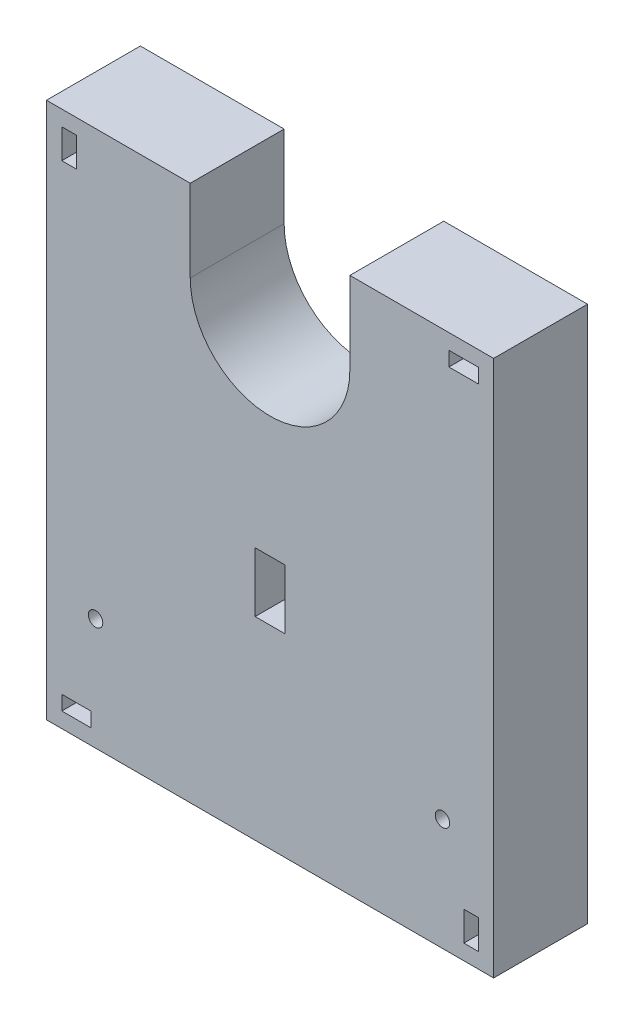
ISO-10303-21;
HEADER;
FILE_DESCRIPTION(('STEP AP214'),'2;1');
FILE_NAME('part.step','',(''),(''),'','','');
FILE_SCHEMA(('AUTOMOTIVE_DESIGN { 1 0 10303 214 1 1 1 1 }'));
ENDSEC;
DATA;
#1=APPLICATION_CONTEXT('core data for automotive mechanical design processes');
#2=APPLICATION_PROTOCOL_DEFINITION('international standard','automotive_design',2000,#1);
#3=PRODUCT_CONTEXT('',#1,'mechanical');
#4=PRODUCT('Part','Part','',(#3));
#5=PRODUCT_RELATED_PRODUCT_CATEGORY('part','',(#4));
#6=PRODUCT_DEFINITION_FORMATION('','',#4);
#7=PRODUCT_DEFINITION_CONTEXT('part definition',#1,'design');
#8=PRODUCT_DEFINITION('design','',#6,#7);
#9=PRODUCT_DEFINITION_SHAPE('','',#8);
#10=(LENGTH_UNIT() NAMED_UNIT(*) SI_UNIT(.MILLI.,.METRE.));
#11=(NAMED_UNIT(*) PLANE_ANGLE_UNIT() SI_UNIT($,.RADIAN.));
#12=(NAMED_UNIT(*) SI_UNIT($,.STERADIAN.) SOLID_ANGLE_UNIT());
#13=UNCERTAINTY_MEASURE_WITH_UNIT(LENGTH_MEASURE(1.E-05),#10,'distance_accuracy_value','');
#14=(GEOMETRIC_REPRESENTATION_CONTEXT(3) GLOBAL_UNCERTAINTY_ASSIGNED_CONTEXT((#13)) GLOBAL_UNIT_ASSIGNED_CONTEXT((#10,
#11,#12)) REPRESENTATION_CONTEXT('',''));
#15=CARTESIAN_POINT('',(0.,0.,0.));
#16=DIRECTION('',(0.,0.,1.));
#17=DIRECTION('',(1.,0.,0.));
#18=AXIS2_PLACEMENT_3D('',#15,#16,#17);
#19=CARTESIAN_POINT('',(47.625,96.8375,20.));
#20=DIRECTION('',(0.,0.,1.));
#21=DIRECTION('',(1.,0.,0.));
#22=AXIS2_PLACEMENT_3D('',#19,#20,#21);
#23=PLANE('',#22);
#24=CARTESIAN_POINT('',(10.4582890568215,23.8529329321801,20.));
#25=DIRECTION('',(0.,0.,1.));
#26=DIRECTION('',(1.,0.,0.));
#27=AXIS2_PLACEMENT_3D('',#24,#25,#26);
#28=CIRCLE('',#27,1.53781619886044);
#29=CARTESIAN_POINT('',(11.9961052556819,23.8529329321801,20.));
#30=VERTEX_POINT('',#29);
#31=EDGE_CURVE('E247',#30,#30,#28,.T.);
#32=ORIENTED_EDGE('',*,*,#31,.F.);
#33=EDGE_LOOP('',(#32));
#34=FACE_BOUND('',#33,.T.);
#35=DIRECTION('',(-1.,0.,0.));
#36=VECTOR('',#35,1.);
#37=CARTESIAN_POINT('',(3.2639,111.0361,20.));
#38=LINE('',#37,#36);
#39=CARTESIAN_POINT('',(6.35,111.0361,20.));
#40=VERTEX_POINT('',#39);
#41=CARTESIAN_POINT('',(3.2639,111.0361,20.));
#42=VERTEX_POINT('',#41);
#43=EDGE_CURVE('E259',#40,#42,#38,.T.);
#44=ORIENTED_EDGE('',*,*,#43,.F.);
#45=DIRECTION('',(0.,1.,0.));
#46=VECTOR('',#45,1.);
#47=CARTESIAN_POINT('',(6.35,104.775,20.));
#48=LINE('',#47,#46);
#49=CARTESIAN_POINT('',(6.35,104.775,20.));
#50=VERTEX_POINT('',#49);
#51=EDGE_CURVE('E257',#50,#40,#48,.T.);
#52=ORIENTED_EDGE('',*,*,#51,.F.);
#53=DIRECTION('',(1.,0.,0.));
#54=VECTOR('',#53,1.);
#55=CARTESIAN_POINT('',(6.35,104.775,20.));
#56=LINE('',#55,#54);
#57=CARTESIAN_POINT('',(3.2639,104.775,20.));
#58=VERTEX_POINT('',#57);
#59=EDGE_CURVE('E265',#58,#50,#56,.T.);
#60=ORIENTED_EDGE('',*,*,#59,.F.);
#61=DIRECTION('',(0.,-1.,0.));
#62=VECTOR('',#61,1.);
#63=CARTESIAN_POINT('',(3.2639,111.0361,20.));
#64=LINE('',#63,#62);
#65=EDGE_CURVE('E262',#42,#58,#64,.T.);
#66=ORIENTED_EDGE('',*,*,#65,.F.);
#67=EDGE_LOOP('',(#44,#52,#60,#66));
#68=FACE_BOUND('',#67,.T.);
#69=DIRECTION('',(-1.,0.,0.));
#70=VECTOR('',#69,1.);
#71=CARTESIAN_POINT('',(44.45,53.975,20.));
#72=LINE('',#71,#70);
#73=CARTESIAN_POINT('',(50.8000000000001,53.975,20.));
#74=VERTEX_POINT('',#73);
#75=CARTESIAN_POINT('',(44.45,53.975,20.));
#76=VERTEX_POINT('',#75);
#77=EDGE_CURVE('E321',#74,#76,#72,.T.);
#78=ORIENTED_EDGE('',*,*,#77,.F.);
#79=DIRECTION('',(0.,1.,0.));
#80=VECTOR('',#79,1.);
#81=CARTESIAN_POINT('',(50.8000000000001,53.975,20.));
#82=LINE('',#81,#80);
#83=CARTESIAN_POINT('',(50.8000000000001,41.275,20.));
#84=VERTEX_POINT('',#83);
#85=EDGE_CURVE('E319',#84,#74,#82,.T.);
#86=ORIENTED_EDGE('',*,*,#85,.F.);
#87=DIRECTION('',(1.,0.,0.));
#88=VECTOR('',#87,1.);
#89=CARTESIAN_POINT('',(50.8000000000001,41.275,20.));
#90=LINE('',#89,#88);
#91=CARTESIAN_POINT('',(44.45,41.275,20.));
#92=VERTEX_POINT('',#91);
#93=EDGE_CURVE('E327',#92,#84,#90,.T.);
#94=ORIENTED_EDGE('',*,*,#93,.F.);
#95=DIRECTION('',(0.,-1.,0.));
#96=VECTOR('',#95,1.);
#97=CARTESIAN_POINT('',(44.45,41.275,20.));
#98=LINE('',#97,#96);
#99=EDGE_CURVE('E324',#76,#92,#98,.T.);
#100=ORIENTED_EDGE('',*,*,#99,.F.);
#101=EDGE_LOOP('',(#78,#86,#94,#100));
#102=FACE_BOUND('',#101,.T.);
#103=DIRECTION('',(0.,-1.,0.));
#104=VECTOR('',#103,1.);
#105=CARTESIAN_POINT('',(0.,0.,20.));
#106=LINE('',#105,#104);
#107=CARTESIAN_POINT('',(0.,114.3,20.));
#108=VERTEX_POINT('',#107);
#109=CARTESIAN_POINT('',(0.,0.,20.));
#110=VERTEX_POINT('',#109);
#111=EDGE_CURVE('E381',#108,#110,#106,.T.);
#112=ORIENTED_EDGE('',*,*,#111,.T.);
#113=DIRECTION('',(1.,0.,0.));
#114=VECTOR('',#113,1.);
#115=CARTESIAN_POINT('',(0.,0.,20.));
#116=LINE('',#115,#114);
#117=CARTESIAN_POINT('',(95.2500000000001,0.,20.));
#118=VERTEX_POINT('',#117);
#119=EDGE_CURVE('E384',#110,#118,#116,.T.);
#120=ORIENTED_EDGE('',*,*,#119,.T.);
#121=DIRECTION('',(0.,1.,0.));
#122=VECTOR('',#121,1.);
#123=CARTESIAN_POINT('',(95.2500000000001,114.3,20.));
#124=LINE('',#123,#122);
#125=CARTESIAN_POINT('',(95.2500000000001,114.3,20.));
#126=VERTEX_POINT('',#125);
#127=EDGE_CURVE('E387',#118,#126,#124,.T.);
#128=ORIENTED_EDGE('',*,*,#127,.T.);
#129=DIRECTION('',(-1.,0.,0.));
#130=VECTOR('',#129,1.);
#131=CARTESIAN_POINT('',(64.625,114.3,20.));
#132=LINE('',#131,#130);
#133=CARTESIAN_POINT('',(64.625,114.3,20.));
#134=VERTEX_POINT('',#133);
#135=EDGE_CURVE('E389',#126,#134,#132,.T.);
#136=ORIENTED_EDGE('',*,*,#135,.T.);
#137=DIRECTION('',(0.,-1.,0.));
#138=VECTOR('',#137,1.);
#139=CARTESIAN_POINT('',(64.625,96.8375,20.));
#140=LINE('',#139,#138);
#141=CARTESIAN_POINT('',(64.625,96.8375,20.));
#142=VERTEX_POINT('',#141);
#143=EDGE_CURVE('E391',#134,#142,#140,.T.);
#144=ORIENTED_EDGE('',*,*,#143,.T.);
#145=CARTESIAN_POINT('',(47.625,96.8375,20.));
#146=DIRECTION('',(0.,0.,-1.));
#147=DIRECTION('',(1.,0.,0.));
#148=AXIS2_PLACEMENT_3D('',#145,#146,#147);
#149=CIRCLE('',#148,17.);
#150=CARTESIAN_POINT('',(30.625,96.8375,20.));
#151=VERTEX_POINT('',#150);
#152=EDGE_CURVE('E393',#142,#151,#149,.T.);
#153=ORIENTED_EDGE('',*,*,#152,.T.);
#154=DIRECTION('',(0.,1.,0.));
#155=VECTOR('',#154,1.);
#156=CARTESIAN_POINT('',(30.625,96.8375,20.));
#157=LINE('',#156,#155);
#158=CARTESIAN_POINT('',(30.625,114.3,20.));
#159=VERTEX_POINT('',#158);
#160=EDGE_CURVE('E395',#151,#159,#157,.T.);
#161=ORIENTED_EDGE('',*,*,#160,.T.);
#162=DIRECTION('',(-1.,0.,0.));
#163=VECTOR('',#162,1.);
#164=CARTESIAN_POINT('',(0.,114.3,20.));
#165=LINE('',#164,#163);
#166=EDGE_CURVE('E397',#159,#108,#165,.T.);
#167=ORIENTED_EDGE('',*,*,#166,.T.);
#168=EDGE_LOOP('',(#112,#120,#128,#136,#144,#153,#161,#167));
#169=FACE_BOUND('',#168,.T.);
#170=DIRECTION('',(1.,0.,0.));
#171=VECTOR('',#170,1.);
#172=CARTESIAN_POINT('',(3.2639,3.2639,20.));
#173=LINE('',#172,#171);
#174=CARTESIAN_POINT('',(3.2639,3.2639,20.));
#175=VERTEX_POINT('',#174);
#176=CARTESIAN_POINT('',(9.525,3.2639,20.));
#177=VERTEX_POINT('',#176);
#178=EDGE_CURVE('E352',#175,#177,#173,.T.);
#179=ORIENTED_EDGE('',*,*,#178,.F.);
#180=DIRECTION('',(0.,-1.,0.));
#181=VECTOR('',#180,1.);
#182=CARTESIAN_POINT('',(3.2639,3.2639,20.));
#183=LINE('',#182,#181);
#184=CARTESIAN_POINT('',(3.2639,6.35,20.));
#185=VERTEX_POINT('',#184);
#186=EDGE_CURVE('E350',#185,#175,#183,.T.);
#187=ORIENTED_EDGE('',*,*,#186,.F.);
#188=DIRECTION('',(-1.,0.,0.));
#189=VECTOR('',#188,1.);
#190=CARTESIAN_POINT('',(9.525,6.35,20.));
#191=LINE('',#190,#189);
#192=CARTESIAN_POINT('',(9.525,6.34999999999999,20.));
#193=VERTEX_POINT('',#192);
#194=EDGE_CURVE('E358',#193,#185,#191,.T.);
#195=ORIENTED_EDGE('',*,*,#194,.F.);
#196=DIRECTION('',(0.,1.,0.));
#197=VECTOR('',#196,1.);
#198=CARTESIAN_POINT('',(9.525,6.35,20.));
#199=LINE('',#198,#197);
#200=EDGE_CURVE('E355',#177,#193,#199,.T.);
#201=ORIENTED_EDGE('',*,*,#200,.F.);
#202=EDGE_LOOP('',(#179,#187,#195,#201));
#203=FACE_BOUND('',#202,.T.);
#204=DIRECTION('',(1.,0.,0.));
#205=VECTOR('',#204,1.);
#206=CARTESIAN_POINT('',(91.9861000000001,3.2639,20.));
#207=LINE('',#206,#205);
#208=CARTESIAN_POINT('',(88.9000000000001,3.2639,20.));
#209=VERTEX_POINT('',#208);
#210=CARTESIAN_POINT('',(91.9861000000001,3.2639,20.));
#211=VERTEX_POINT('',#210);
#212=EDGE_CURVE('E290',#209,#211,#207,.T.);
#213=ORIENTED_EDGE('',*,*,#212,.F.);
#214=DIRECTION('',(0.,-1.,0.));
#215=VECTOR('',#214,1.);
#216=CARTESIAN_POINT('',(88.9000000000001,9.525,20.));
#217=LINE('',#216,#215);
#218=CARTESIAN_POINT('',(88.9000000000001,9.525,20.));
#219=VERTEX_POINT('',#218);
#220=EDGE_CURVE('E288',#219,#209,#217,.T.);
#221=ORIENTED_EDGE('',*,*,#220,.F.);
#222=DIRECTION('',(-1.,0.,0.));
#223=VECTOR('',#222,1.);
#224=CARTESIAN_POINT('',(88.9000000000001,9.525,20.));
#225=LINE('',#224,#223);
#226=CARTESIAN_POINT('',(91.9861000000001,9.52500000000001,20.));
#227=VERTEX_POINT('',#226);
#228=EDGE_CURVE('E296',#227,#219,#225,.T.);
#229=ORIENTED_EDGE('',*,*,#228,.F.);
#230=DIRECTION('',(0.,1.,0.));
#231=VECTOR('',#230,1.);
#232=CARTESIAN_POINT('',(91.9861000000001,3.2639,20.));
#233=LINE('',#232,#231);
#234=EDGE_CURVE('E293',#211,#227,#233,.T.);
#235=ORIENTED_EDGE('',*,*,#234,.F.);
#236=EDGE_LOOP('',(#213,#221,#229,#235));
#237=FACE_BOUND('',#236,.T.);
#238=DIRECTION('',(-1.,0.,0.));
#239=VECTOR('',#238,1.);
#240=CARTESIAN_POINT('',(91.9861000000001,111.0361,20.));
#241=LINE('',#240,#239);
#242=CARTESIAN_POINT('',(91.9861000000001,111.0361,20.));
#243=VERTEX_POINT('',#242);
#244=CARTESIAN_POINT('',(85.7250000000001,111.0361,20.));
#245=VERTEX_POINT('',#244);
#246=EDGE_CURVE('E226',#243,#245,#241,.T.);
#247=ORIENTED_EDGE('',*,*,#246,.F.);
#248=DIRECTION('',(0.,1.,0.));
#249=VECTOR('',#248,1.);
#250=CARTESIAN_POINT('',(91.9861000000001,111.0361,20.));
#251=LINE('',#250,#249);
#252=CARTESIAN_POINT('',(91.9861000000001,107.95,20.));
#253=VERTEX_POINT('',#252);
#254=EDGE_CURVE('E218',#253,#243,#251,.T.);
#255=ORIENTED_EDGE('',*,*,#254,.F.);
#256=DIRECTION('',(1.,0.,0.));
#257=VECTOR('',#256,1.);
#258=CARTESIAN_POINT('',(85.7250000000001,107.95,20.));
#259=LINE('',#258,#257);
#260=CARTESIAN_POINT('',(85.7250000000001,107.95,20.));
#261=VERTEX_POINT('',#260);
#262=EDGE_CURVE('E241',#261,#253,#259,.T.);
#263=ORIENTED_EDGE('',*,*,#262,.F.);
#264=DIRECTION('',(0.,-1.,0.));
#265=VECTOR('',#264,1.);
#266=CARTESIAN_POINT('',(85.7250000000001,107.95,20.));
#267=LINE('',#266,#265);
#268=EDGE_CURVE('E239',#245,#261,#267,.T.);
#269=ORIENTED_EDGE('',*,*,#268,.F.);
#270=EDGE_LOOP('',(#247,#255,#263,#269));
#271=FACE_BOUND('',#270,.T.);
#272=CARTESIAN_POINT('',(84.3480052556819,23.8529329321801,20.));
#273=DIRECTION('',(0.,0.,1.));
#274=DIRECTION('',(1.,0.,0.));
#275=AXIS2_PLACEMENT_3D('',#272,#273,#274);
#276=CIRCLE('',#275,1.53669999999999);
#277=CARTESIAN_POINT('',(85.8847052556819,23.8529329321801,20.));
#278=VERTEX_POINT('',#277);
#279=EDGE_CURVE('E711',#278,#278,#276,.T.);
#280=ORIENTED_EDGE('',*,*,#279,.F.);
#281=EDGE_LOOP('',(#280));
#282=FACE_BOUND('',#281,.T.);
#283=ADVANCED_FACE('F33',(#34,#68,#102,#169,#203,#237,#271,#282),#23,.T.);
#284=CARTESIAN_POINT('',(47.625,96.8375,0.));
#285=DIRECTION('',(0.,0.,1.));
#286=DIRECTION('',(1.,0.,0.));
#287=AXIS2_PLACEMENT_3D('',#284,#285,#286);
#288=PLANE('',#287);
#289=CARTESIAN_POINT('',(10.4582890568215,23.8529329321801,0.));
#290=DIRECTION('',(0.,0.,1.));
#291=DIRECTION('',(1.,0.,0.));
#292=AXIS2_PLACEMENT_3D('',#289,#290,#291);
#293=CIRCLE('',#292,1.53781619886044);
#294=CARTESIAN_POINT('',(11.9961052556819,23.8529329321801,0.));
#295=VERTEX_POINT('',#294);
#296=EDGE_CURVE('E717',#295,#295,#293,.T.);
#297=ORIENTED_EDGE('',*,*,#296,.T.);
#298=EDGE_LOOP('',(#297));
#299=FACE_BOUND('',#298,.T.);
#300=DIRECTION('',(0.,1.,0.));
#301=VECTOR('',#300,1.);
#302=CARTESIAN_POINT('',(6.35,104.775,0.));
#303=LINE('',#302,#301);
#304=CARTESIAN_POINT('',(6.34999999999999,104.775,0.));
#305=VERTEX_POINT('',#304);
#306=CARTESIAN_POINT('',(6.35,111.0361,0.));
#307=VERTEX_POINT('',#306);
#308=EDGE_CURVE('E234',#305,#307,#303,.T.);
#309=ORIENTED_EDGE('',*,*,#308,.T.);
#310=DIRECTION('',(-1.,0.,0.));
#311=VECTOR('',#310,1.);
#312=CARTESIAN_POINT('',(3.2639,111.0361,0.));
#313=LINE('',#312,#311);
#314=CARTESIAN_POINT('',(3.2639,111.0361,0.));
#315=VERTEX_POINT('',#314);
#316=EDGE_CURVE('E270',#307,#315,#313,.T.);
#317=ORIENTED_EDGE('',*,*,#316,.T.);
#318=DIRECTION('',(0.,-1.,0.));
#319=VECTOR('',#318,1.);
#320=CARTESIAN_POINT('',(3.2639,111.0361,0.));
#321=LINE('',#320,#319);
#322=CARTESIAN_POINT('',(3.2639,104.775,0.));
#323=VERTEX_POINT('',#322);
#324=EDGE_CURVE('E273',#315,#323,#321,.T.);
#325=ORIENTED_EDGE('',*,*,#324,.T.);
#326=DIRECTION('',(1.,0.,0.));
#327=VECTOR('',#326,1.);
#328=CARTESIAN_POINT('',(6.35,104.775,0.));
#329=LINE('',#328,#327);
#330=EDGE_CURVE('E260',#323,#305,#329,.T.);
#331=ORIENTED_EDGE('',*,*,#330,.T.);
#332=EDGE_LOOP('',(#309,#317,#325,#331));
#333=FACE_BOUND('',#332,.T.);
#334=DIRECTION('',(0.,1.,0.));
#335=VECTOR('',#334,1.);
#336=CARTESIAN_POINT('',(50.8000000000001,53.975,0.));
#337=LINE('',#336,#335);
#338=CARTESIAN_POINT('',(50.8000000000001,41.275,0.));
#339=VERTEX_POINT('',#338);
#340=CARTESIAN_POINT('',(50.8000000000001,53.975,0.));
#341=VERTEX_POINT('',#340);
#342=EDGE_CURVE('E318',#339,#341,#337,.T.);
#343=ORIENTED_EDGE('',*,*,#342,.T.);
#344=DIRECTION('',(-1.,0.,0.));
#345=VECTOR('',#344,1.);
#346=CARTESIAN_POINT('',(44.45,53.975,0.));
#347=LINE('',#346,#345);
#348=CARTESIAN_POINT('',(44.45,53.975,0.));
#349=VERTEX_POINT('',#348);
#350=EDGE_CURVE('E332',#341,#349,#347,.T.);
#351=ORIENTED_EDGE('',*,*,#350,.T.);
#352=DIRECTION('',(0.,-1.,0.));
#353=VECTOR('',#352,1.);
#354=CARTESIAN_POINT('',(44.45,41.275,0.));
#355=LINE('',#354,#353);
#356=CARTESIAN_POINT('',(44.45,41.275,0.));
#357=VERTEX_POINT('',#356);
#358=EDGE_CURVE('E335',#349,#357,#355,.T.);
#359=ORIENTED_EDGE('',*,*,#358,.T.);
#360=DIRECTION('',(1.,0.,0.));
#361=VECTOR('',#360,1.);
#362=CARTESIAN_POINT('',(50.8000000000001,41.275,0.));
#363=LINE('',#362,#361);
#364=EDGE_CURVE('E322',#357,#339,#363,.T.);
#365=ORIENTED_EDGE('',*,*,#364,.T.);
#366=EDGE_LOOP('',(#343,#351,#359,#365));
#367=FACE_BOUND('',#366,.T.);
#368=DIRECTION('',(0.,-1.,0.));
#369=VECTOR('',#368,1.);
#370=CARTESIAN_POINT('',(0.,0.,0.));
#371=LINE('',#370,#369);
#372=CARTESIAN_POINT('',(0.,114.3,0.));
#373=VERTEX_POINT('',#372);
#374=CARTESIAN_POINT('',(0.,0.,0.));
#375=VERTEX_POINT('',#374);
#376=EDGE_CURVE('E380',#373,#375,#371,.T.);
#377=ORIENTED_EDGE('',*,*,#376,.F.);
#378=DIRECTION('',(-1.,0.,0.));
#379=VECTOR('',#378,1.);
#380=CARTESIAN_POINT('',(0.,114.3,0.));
#381=LINE('',#380,#379);
#382=CARTESIAN_POINT('',(30.625,114.3,0.));
#383=VERTEX_POINT('',#382);
#384=EDGE_CURVE('E385',#383,#373,#381,.T.);
#385=ORIENTED_EDGE('',*,*,#384,.F.);
#386=DIRECTION('',(0.,1.,0.));
#387=VECTOR('',#386,1.);
#388=CARTESIAN_POINT('',(30.625,96.8375,0.));
#389=LINE('',#388,#387);
#390=CARTESIAN_POINT('',(30.625,96.8375,0.));
#391=VERTEX_POINT('',#390);
#392=EDGE_CURVE('E412',#391,#383,#389,.T.);
#393=ORIENTED_EDGE('',*,*,#392,.F.);
#394=CARTESIAN_POINT('',(47.625,96.8375,0.));
#395=DIRECTION('',(0.,0.,-1.));
#396=DIRECTION('',(1.,0.,0.));
#397=AXIS2_PLACEMENT_3D('',#394,#395,#396);
#398=CIRCLE('',#397,17.);
#399=CARTESIAN_POINT('',(64.625,96.8375,0.));
#400=VERTEX_POINT('',#399);
#401=EDGE_CURVE('E410',#400,#391,#398,.T.);
#402=ORIENTED_EDGE('',*,*,#401,.F.);
#403=DIRECTION('',(0.,-1.,0.));
#404=VECTOR('',#403,1.);
#405=CARTESIAN_POINT('',(64.625,96.8375,0.));
#406=LINE('',#405,#404);
#407=CARTESIAN_POINT('',(64.625,114.3,0.));
#408=VERTEX_POINT('',#407);
#409=EDGE_CURVE('E408',#408,#400,#406,.T.);
#410=ORIENTED_EDGE('',*,*,#409,.F.);
#411=DIRECTION('',(-1.,0.,0.));
#412=VECTOR('',#411,1.);
#413=CARTESIAN_POINT('',(64.625,114.3,0.));
#414=LINE('',#413,#412);
#415=CARTESIAN_POINT('',(95.2500000000001,114.3,0.));
#416=VERTEX_POINT('',#415);
#417=EDGE_CURVE('E406',#416,#408,#414,.T.);
#418=ORIENTED_EDGE('',*,*,#417,.F.);
#419=DIRECTION('',(0.,1.,0.));
#420=VECTOR('',#419,1.);
#421=CARTESIAN_POINT('',(95.2500000000001,114.3,0.));
#422=LINE('',#421,#420);
#423=CARTESIAN_POINT('',(95.2500000000001,0.,0.));
#424=VERTEX_POINT('',#423);
#425=EDGE_CURVE('E404',#424,#416,#422,.T.);
#426=ORIENTED_EDGE('',*,*,#425,.F.);
#427=DIRECTION('',(1.,0.,0.));
#428=VECTOR('',#427,1.);
#429=CARTESIAN_POINT('',(0.,0.,0.));
#430=LINE('',#429,#428);
#431=EDGE_CURVE('E402',#375,#424,#430,.T.);
#432=ORIENTED_EDGE('',*,*,#431,.F.);
#433=EDGE_LOOP('',(#377,#385,#393,#402,#410,#418,#426,#432));
#434=FACE_BOUND('',#433,.T.);
#435=DIRECTION('',(0.,-1.,0.));
#436=VECTOR('',#435,1.);
#437=CARTESIAN_POINT('',(3.2639,3.2639,0.));
#438=LINE('',#437,#436);
#439=CARTESIAN_POINT('',(3.2639,6.34999999999999,0.));
#440=VERTEX_POINT('',#439);
#441=CARTESIAN_POINT('',(3.2639,3.2639,0.));
#442=VERTEX_POINT('',#441);
#443=EDGE_CURVE('E349',#440,#442,#438,.T.);
#444=ORIENTED_EDGE('',*,*,#443,.T.);
#445=DIRECTION('',(1.,0.,0.));
#446=VECTOR('',#445,1.);
#447=CARTESIAN_POINT('',(3.2639,3.2639,0.));
#448=LINE('',#447,#446);
#449=CARTESIAN_POINT('',(9.525,3.2639,0.));
#450=VERTEX_POINT('',#449);
#451=EDGE_CURVE('E363',#442,#450,#448,.T.);
#452=ORIENTED_EDGE('',*,*,#451,.T.);
#453=DIRECTION('',(0.,1.,0.));
#454=VECTOR('',#453,1.);
#455=CARTESIAN_POINT('',(9.525,6.35,0.));
#456=LINE('',#455,#454);
#457=CARTESIAN_POINT('',(9.525,6.35,0.));
#458=VERTEX_POINT('',#457);
#459=EDGE_CURVE('E366',#450,#458,#456,.T.);
#460=ORIENTED_EDGE('',*,*,#459,.T.);
#461=DIRECTION('',(-1.,0.,0.));
#462=VECTOR('',#461,1.);
#463=CARTESIAN_POINT('',(9.525,6.35,0.));
#464=LINE('',#463,#462);
#465=EDGE_CURVE('E353',#458,#440,#464,.T.);
#466=ORIENTED_EDGE('',*,*,#465,.T.);
#467=EDGE_LOOP('',(#444,#452,#460,#466));
#468=FACE_BOUND('',#467,.T.);
#469=DIRECTION('',(0.,-1.,0.));
#470=VECTOR('',#469,1.);
#471=CARTESIAN_POINT('',(88.9000000000001,9.525,0.));
#472=LINE('',#471,#470);
#473=CARTESIAN_POINT('',(88.9000000000001,9.52500000000001,0.));
#474=VERTEX_POINT('',#473);
#475=CARTESIAN_POINT('',(88.9000000000001,3.2639,0.));
#476=VERTEX_POINT('',#475);
#477=EDGE_CURVE('E287',#474,#476,#472,.T.);
#478=ORIENTED_EDGE('',*,*,#477,.T.);
#479=DIRECTION('',(1.,0.,0.));
#480=VECTOR('',#479,1.);
#481=CARTESIAN_POINT('',(91.9861000000001,3.2639,0.));
#482=LINE('',#481,#480);
#483=CARTESIAN_POINT('',(91.9861000000001,3.2639,0.));
#484=VERTEX_POINT('',#483);
#485=EDGE_CURVE('E301',#476,#484,#482,.T.);
#486=ORIENTED_EDGE('',*,*,#485,.T.);
#487=DIRECTION('',(0.,1.,0.));
#488=VECTOR('',#487,1.);
#489=CARTESIAN_POINT('',(91.9861000000001,3.2639,0.));
#490=LINE('',#489,#488);
#491=CARTESIAN_POINT('',(91.9861000000001,9.525,0.));
#492=VERTEX_POINT('',#491);
#493=EDGE_CURVE('E304',#484,#492,#490,.T.);
#494=ORIENTED_EDGE('',*,*,#493,.T.);
#495=DIRECTION('',(-1.,0.,0.));
#496=VECTOR('',#495,1.);
#497=CARTESIAN_POINT('',(88.9000000000001,9.525,0.));
#498=LINE('',#497,#496);
#499=EDGE_CURVE('E291',#492,#474,#498,.T.);
#500=ORIENTED_EDGE('',*,*,#499,.T.);
#501=EDGE_LOOP('',(#478,#486,#494,#500));
#502=FACE_BOUND('',#501,.T.);
#503=DIRECTION('',(0.,1.,0.));
#504=VECTOR('',#503,1.);
#505=CARTESIAN_POINT('',(91.9861000000001,111.0361,0.));
#506=LINE('',#505,#504);
#507=CARTESIAN_POINT('',(91.9861000000001,107.95,0.));
#508=VERTEX_POINT('',#507);
#509=CARTESIAN_POINT('',(91.9861000000001,111.0361,0.));
#510=VERTEX_POINT('',#509);
#511=EDGE_CURVE('E56',#508,#510,#506,.T.);
#512=ORIENTED_EDGE('',*,*,#511,.T.);
#513=DIRECTION('',(-1.,0.,0.));
#514=VECTOR('',#513,1.);
#515=CARTESIAN_POINT('',(91.9861000000001,111.0361,0.));
#516=LINE('',#515,#514);
#517=CARTESIAN_POINT('',(85.7250000000001,111.0361,0.));
#518=VERTEX_POINT('',#517);
#519=EDGE_CURVE('E233',#510,#518,#516,.T.);
#520=ORIENTED_EDGE('',*,*,#519,.T.);
#521=DIRECTION('',(0.,-1.,0.));
#522=VECTOR('',#521,1.);
#523=CARTESIAN_POINT('',(85.7250000000001,107.95,0.));
#524=LINE('',#523,#522);
#525=CARTESIAN_POINT('',(85.7250000000001,107.95,0.));
#526=VERTEX_POINT('',#525);
#527=EDGE_CURVE('E249',#518,#526,#524,.T.);
#528=ORIENTED_EDGE('',*,*,#527,.T.);
#529=DIRECTION('',(1.,0.,0.));
#530=VECTOR('',#529,1.);
#531=CARTESIAN_POINT('',(85.7250000000001,107.95,0.));
#532=LINE('',#531,#530);
#533=EDGE_CURVE('E227',#526,#508,#532,.T.);
#534=ORIENTED_EDGE('',*,*,#533,.T.);
#535=EDGE_LOOP('',(#512,#520,#528,#534));
#536=FACE_BOUND('',#535,.T.);
#537=CARTESIAN_POINT('',(84.3480052556819,23.8529329321801,0.));
#538=DIRECTION('',(0.,0.,1.));
#539=DIRECTION('',(1.,0.,0.));
#540=AXIS2_PLACEMENT_3D('',#537,#538,#539);
#541=CIRCLE('',#540,1.53669999999999);
#542=CARTESIAN_POINT('',(85.8847052556819,23.8529329321801,0.));
#543=VERTEX_POINT('',#542);
#544=EDGE_CURVE('E714',#543,#543,#541,.T.);
#545=ORIENTED_EDGE('',*,*,#544,.T.);
#546=EDGE_LOOP('',(#545));
#547=FACE_BOUND('',#546,.T.);
#548=ADVANCED_FACE('F442',(#299,#333,#367,#434,#468,#502,#536,#547),#288,.F.);
#549=CARTESIAN_POINT('',(0.,0.,20.));
#550=DIRECTION('',(1.,0.,0.));
#551=DIRECTION('',(0.,0.,-1.));
#552=AXIS2_PLACEMENT_3D('',#549,#550,#551);
#553=PLANE('',#552);
#554=ORIENTED_EDGE('',*,*,#376,.T.);
#555=DIRECTION('',(0.,0.,-1.));
#556=VECTOR('',#555,1.);
#557=CARTESIAN_POINT('',(0.,0.,20.));
#558=LINE('',#557,#556);
#559=EDGE_CURVE('E11',#110,#375,#558,.T.);
#560=ORIENTED_EDGE('',*,*,#559,.F.);
#561=ORIENTED_EDGE('',*,*,#111,.F.);
#562=DIRECTION('',(0.,0.,-1.));
#563=VECTOR('',#562,1.);
#564=CARTESIAN_POINT('',(0.,114.3,20.));
#565=LINE('',#564,#563);
#566=EDGE_CURVE('E399',#108,#373,#565,.T.);
#567=ORIENTED_EDGE('',*,*,#566,.T.);
#568=EDGE_LOOP('',(#554,#560,#561,#567));
#569=FACE_BOUND('',#568,.T.);
#570=ADVANCED_FACE('F35',(#569),#553,.F.);
#571=CARTESIAN_POINT('',(0.,0.,20.));
#572=DIRECTION('',(0.,1.,0.));
#573=DIRECTION('',(0.,0.,1.));
#574=AXIS2_PLACEMENT_3D('',#571,#572,#573);
#575=PLANE('',#574);
#576=ORIENTED_EDGE('',*,*,#431,.T.);
#577=DIRECTION('',(0.,0.,-1.));
#578=VECTOR('',#577,1.);
#579=CARTESIAN_POINT('',(95.2500000000001,0.,20.));
#580=LINE('',#579,#578);
#581=EDGE_CURVE('E41',#118,#424,#580,.T.);
#582=ORIENTED_EDGE('',*,*,#581,.F.);
#583=ORIENTED_EDGE('',*,*,#119,.F.);
#584=ORIENTED_EDGE('',*,*,#559,.T.);
#585=EDGE_LOOP('',(#576,#582,#583,#584));
#586=FACE_BOUND('',#585,.T.);
#587=ADVANCED_FACE('F460',(#586),#575,.F.);
#588=CARTESIAN_POINT('',(95.2500000000001,114.3,20.));
#589=DIRECTION('',(-1.,0.,0.));
#590=DIRECTION('',(0.,0.,1.));
#591=AXIS2_PLACEMENT_3D('',#588,#589,#590);
#592=PLANE('',#591);
#593=ORIENTED_EDGE('',*,*,#425,.T.);
#594=DIRECTION('',(0.,0.,-1.));
#595=VECTOR('',#594,1.);
#596=CARTESIAN_POINT('',(95.2500000000001,114.3,20.));
#597=LINE('',#596,#595);
#598=EDGE_CURVE('E429',#126,#416,#597,.T.);
#599=ORIENTED_EDGE('',*,*,#598,.F.);
#600=ORIENTED_EDGE('',*,*,#127,.F.);
#601=ORIENTED_EDGE('',*,*,#581,.T.);
#602=EDGE_LOOP('',(#593,#599,#600,#601));
#603=FACE_BOUND('',#602,.T.);
#604=ADVANCED_FACE('F436',(#603),#592,.F.);
#605=CARTESIAN_POINT('',(64.625,114.3,20.));
#606=DIRECTION('',(0.,-1.,0.));
#607=DIRECTION('',(0.,0.,-1.));
#608=AXIS2_PLACEMENT_3D('',#605,#606,#607);
#609=PLANE('',#608);
#610=ORIENTED_EDGE('',*,*,#417,.T.);
#611=DIRECTION('',(0.,0.,-1.));
#612=VECTOR('',#611,1.);
#613=CARTESIAN_POINT('',(64.625,114.3,20.));
#614=LINE('',#613,#612);
#615=EDGE_CURVE('E426',#134,#408,#614,.T.);
#616=ORIENTED_EDGE('',*,*,#615,.F.);
#617=ORIENTED_EDGE('',*,*,#135,.F.);
#618=ORIENTED_EDGE('',*,*,#598,.T.);
#619=EDGE_LOOP('',(#610,#616,#617,#618));
#620=FACE_BOUND('',#619,.T.);
#621=ADVANCED_FACE('F448',(#620),#609,.F.);
#622=CARTESIAN_POINT('',(64.625,96.8375,20.));
#623=DIRECTION('',(1.,0.,0.));
#624=DIRECTION('',(0.,0.,-1.));
#625=AXIS2_PLACEMENT_3D('',#622,#623,#624);
#626=PLANE('',#625);
#627=ORIENTED_EDGE('',*,*,#409,.T.);
#628=DIRECTION('',(0.,0.,-1.));
#629=VECTOR('',#628,1.);
#630=CARTESIAN_POINT('',(64.625,96.8375,20.));
#631=LINE('',#630,#629);
#632=EDGE_CURVE('E423',#142,#400,#631,.T.);
#633=ORIENTED_EDGE('',*,*,#632,.F.);
#634=ORIENTED_EDGE('',*,*,#143,.F.);
#635=ORIENTED_EDGE('',*,*,#615,.T.);
#636=EDGE_LOOP('',(#627,#633,#634,#635));
#637=FACE_BOUND('',#636,.T.);
#638=ADVANCED_FACE('F452',(#637),#626,.F.);
#639=CARTESIAN_POINT('',(47.625,96.8375,20.));
#640=DIRECTION('',(0.,0.,-1.));
#641=DIRECTION('',(-1.,0.,0.));
#642=AXIS2_PLACEMENT_3D('',#639,#640,#641);
#643=CYLINDRICAL_SURFACE('',#642,17.);
#644=ORIENTED_EDGE('',*,*,#401,.T.);
#645=DIRECTION('',(0.,0.,-1.));
#646=VECTOR('',#645,1.);
#647=CARTESIAN_POINT('',(30.625,96.8375,20.));
#648=LINE('',#647,#646);
#649=EDGE_CURVE('E420',#151,#391,#648,.T.);
#650=ORIENTED_EDGE('',*,*,#649,.F.);
#651=ORIENTED_EDGE('',*,*,#152,.F.);
#652=ORIENTED_EDGE('',*,*,#632,.T.);
#653=EDGE_LOOP('',(#644,#650,#651,#652));
#654=FACE_BOUND('',#653,.T.);
#655=ADVANCED_FACE('F473',(#654),#643,.F.);
#656=CARTESIAN_POINT('',(30.625,96.8375,20.));
#657=DIRECTION('',(-1.,0.,0.));
#658=DIRECTION('',(0.,0.,1.));
#659=AXIS2_PLACEMENT_3D('',#656,#657,#658);
#660=PLANE('',#659);
#661=ORIENTED_EDGE('',*,*,#392,.T.);
#662=DIRECTION('',(0.,0.,-1.));
#663=VECTOR('',#662,1.);
#664=CARTESIAN_POINT('',(30.625,114.3,20.));
#665=LINE('',#664,#663);
#666=EDGE_CURVE('E417',#159,#383,#665,.T.);
#667=ORIENTED_EDGE('',*,*,#666,.F.);
#668=ORIENTED_EDGE('',*,*,#160,.F.);
#669=ORIENTED_EDGE('',*,*,#649,.T.);
#670=EDGE_LOOP('',(#661,#667,#668,#669));
#671=FACE_BOUND('',#670,.T.);
#672=ADVANCED_FACE('F471',(#671),#660,.F.);
#673=CARTESIAN_POINT('',(0.,114.3,20.));
#674=DIRECTION('',(0.,-1.,0.));
#675=DIRECTION('',(0.,0.,-1.));
#676=AXIS2_PLACEMENT_3D('',#673,#674,#675);
#677=PLANE('',#676);
#678=ORIENTED_EDGE('',*,*,#384,.T.);
#679=ORIENTED_EDGE('',*,*,#566,.F.);
#680=ORIENTED_EDGE('',*,*,#166,.F.);
#681=ORIENTED_EDGE('',*,*,#666,.T.);
#682=EDGE_LOOP('',(#678,#679,#680,#681));
#683=FACE_BOUND('',#682,.T.);
#684=ADVANCED_FACE('F466',(#683),#677,.F.);
#685=CARTESIAN_POINT('',(3.2639,3.2639,20.));
#686=DIRECTION('',(1.,0.,0.));
#687=DIRECTION('',(0.,1.,0.));
#688=AXIS2_PLACEMENT_3D('',#685,#686,#687);
#689=PLANE('',#688);
#690=ORIENTED_EDGE('',*,*,#443,.F.);
#691=DIRECTION('',(0.,0.,-1.));
#692=VECTOR('',#691,1.);
#693=CARTESIAN_POINT('',(3.2639,6.35,20.));
#694=LINE('',#693,#692);
#695=EDGE_CURVE('E360',#185,#440,#694,.T.);
#696=ORIENTED_EDGE('',*,*,#695,.F.);
#697=ORIENTED_EDGE('',*,*,#186,.T.);
#698=DIRECTION('',(0.,0.,-1.));
#699=VECTOR('',#698,1.);
#700=CARTESIAN_POINT('',(3.2639,3.2639,20.));
#701=LINE('',#700,#699);
#702=EDGE_CURVE('E377',#175,#442,#701,.T.);
#703=ORIENTED_EDGE('',*,*,#702,.T.);
#704=EDGE_LOOP('',(#690,#696,#697,#703));
#705=FACE_BOUND('',#704,.T.);
#706=ADVANCED_FACE('F493',(#705),#689,.T.);
#707=CARTESIAN_POINT('',(3.2639,3.2639,20.));
#708=DIRECTION('',(0.,1.,0.));
#709=DIRECTION('',(0.,0.,1.));
#710=AXIS2_PLACEMENT_3D('',#707,#708,#709);
#711=PLANE('',#710);
#712=ORIENTED_EDGE('',*,*,#451,.F.);
#713=ORIENTED_EDGE('',*,*,#702,.F.);
#714=ORIENTED_EDGE('',*,*,#178,.T.);
#715=DIRECTION('',(0.,0.,-1.));
#716=VECTOR('',#715,1.);
#717=CARTESIAN_POINT('',(9.525,3.2639,20.));
#718=LINE('',#717,#716);
#719=EDGE_CURVE('E375',#177,#450,#718,.T.);
#720=ORIENTED_EDGE('',*,*,#719,.T.);
#721=EDGE_LOOP('',(#712,#713,#714,#720));
#722=FACE_BOUND('',#721,.T.);
#723=ADVANCED_FACE('F500',(#722),#711,.T.);
#724=CARTESIAN_POINT('',(9.525,6.35,20.));
#725=DIRECTION('',(-1.,0.,0.));
#726=DIRECTION('',(0.,0.,1.));
#727=AXIS2_PLACEMENT_3D('',#724,#725,#726);
#728=PLANE('',#727);
#729=ORIENTED_EDGE('',*,*,#459,.F.);
#730=ORIENTED_EDGE('',*,*,#719,.F.);
#731=ORIENTED_EDGE('',*,*,#200,.T.);
#732=DIRECTION('',(0.,0.,-1.));
#733=VECTOR('',#732,1.);
#734=CARTESIAN_POINT('',(9.525,6.35,20.));
#735=LINE('',#734,#733);
#736=EDGE_CURVE('E373',#193,#458,#735,.T.);
#737=ORIENTED_EDGE('',*,*,#736,.T.);
#738=EDGE_LOOP('',(#729,#730,#731,#737));
#739=FACE_BOUND('',#738,.T.);
#740=ADVANCED_FACE('F505',(#739),#728,.T.);
#741=CARTESIAN_POINT('',(9.525,6.35,20.));
#742=DIRECTION('',(0.,-1.,0.));
#743=DIRECTION('',(1.,0.,0.));
#744=AXIS2_PLACEMENT_3D('',#741,#742,#743);
#745=PLANE('',#744);
#746=ORIENTED_EDGE('',*,*,#465,.F.);
#747=ORIENTED_EDGE('',*,*,#736,.F.);
#748=ORIENTED_EDGE('',*,*,#194,.T.);
#749=ORIENTED_EDGE('',*,*,#695,.T.);
#750=EDGE_LOOP('',(#746,#747,#748,#749));
#751=FACE_BOUND('',#750,.T.);
#752=ADVANCED_FACE('F512',(#751),#745,.T.);
#753=CARTESIAN_POINT('',(50.8000000000001,53.975,20.));
#754=DIRECTION('',(-1.,0.,0.));
#755=DIRECTION('',(0.,0.,1.));
#756=AXIS2_PLACEMENT_3D('',#753,#754,#755);
#757=PLANE('',#756);
#758=ORIENTED_EDGE('',*,*,#342,.F.);
#759=DIRECTION('',(0.,0.,-1.));
#760=VECTOR('',#759,1.);
#761=CARTESIAN_POINT('',(50.8000000000001,41.275,20.));
#762=LINE('',#761,#760);
#763=EDGE_CURVE('E329',#84,#339,#762,.T.);
#764=ORIENTED_EDGE('',*,*,#763,.F.);
#765=ORIENTED_EDGE('',*,*,#85,.T.);
#766=DIRECTION('',(0.,0.,-1.));
#767=VECTOR('',#766,1.);
#768=CARTESIAN_POINT('',(50.8000000000001,53.975,20.));
#769=LINE('',#768,#767);
#770=EDGE_CURVE('E346',#74,#341,#769,.T.);
#771=ORIENTED_EDGE('',*,*,#770,.T.);
#772=EDGE_LOOP('',(#758,#764,#765,#771));
#773=FACE_BOUND('',#772,.T.);
#774=ADVANCED_FACE('F567',(#773),#757,.T.);
#775=CARTESIAN_POINT('',(44.45,53.975,20.));
#776=DIRECTION('',(0.,-1.,0.));
#777=DIRECTION('',(0.,0.,-1.));
#778=AXIS2_PLACEMENT_3D('',#775,#776,#777);
#779=PLANE('',#778);
#780=ORIENTED_EDGE('',*,*,#350,.F.);
#781=ORIENTED_EDGE('',*,*,#770,.F.);
#782=ORIENTED_EDGE('',*,*,#77,.T.);
#783=DIRECTION('',(0.,0.,-1.));
#784=VECTOR('',#783,1.);
#785=CARTESIAN_POINT('',(44.45,53.975,20.));
#786=LINE('',#785,#784);
#787=EDGE_CURVE('E344',#76,#349,#786,.T.);
#788=ORIENTED_EDGE('',*,*,#787,.T.);
#789=EDGE_LOOP('',(#780,#781,#782,#788));
#790=FACE_BOUND('',#789,.T.);
#791=ADVANCED_FACE('F563',(#790),#779,.T.);
#792=CARTESIAN_POINT('',(44.45,41.275,20.));
#793=DIRECTION('',(1.,0.,0.));
#794=DIRECTION('',(0.,0.,-1.));
#795=AXIS2_PLACEMENT_3D('',#792,#793,#794);
#796=PLANE('',#795);
#797=ORIENTED_EDGE('',*,*,#358,.F.);
#798=ORIENTED_EDGE('',*,*,#787,.F.);
#799=ORIENTED_EDGE('',*,*,#99,.T.);
#800=DIRECTION('',(0.,0.,-1.));
#801=VECTOR('',#800,1.);
#802=CARTESIAN_POINT('',(44.45,41.275,20.));
#803=LINE('',#802,#801);
#804=EDGE_CURVE('E342',#92,#357,#803,.T.);
#805=ORIENTED_EDGE('',*,*,#804,.T.);
#806=EDGE_LOOP('',(#797,#798,#799,#805));
#807=FACE_BOUND('',#806,.T.);
#808=ADVANCED_FACE('F559',(#807),#796,.T.);
#809=CARTESIAN_POINT('',(50.8000000000001,41.275,20.));
#810=DIRECTION('',(0.,1.,0.));
#811=DIRECTION('',(0.,0.,1.));
#812=AXIS2_PLACEMENT_3D('',#809,#810,#811);
#813=PLANE('',#812);
#814=ORIENTED_EDGE('',*,*,#364,.F.);
#815=ORIENTED_EDGE('',*,*,#804,.F.);
#816=ORIENTED_EDGE('',*,*,#93,.T.);
#817=ORIENTED_EDGE('',*,*,#763,.T.);
#818=EDGE_LOOP('',(#814,#815,#816,#817));
#819=FACE_BOUND('',#818,.T.);
#820=ADVANCED_FACE('F556',(#819),#813,.T.);
#821=CARTESIAN_POINT('',(88.9000000000001,9.525,20.));
#822=DIRECTION('',(1.,0.,0.));
#823=DIRECTION('',(0.,1.,0.));
#824=AXIS2_PLACEMENT_3D('',#821,#822,#823);
#825=PLANE('',#824);
#826=ORIENTED_EDGE('',*,*,#477,.F.);
#827=DIRECTION('',(0.,0.,-1.));
#828=VECTOR('',#827,1.);
#829=CARTESIAN_POINT('',(88.9000000000001,9.525,20.));
#830=LINE('',#829,#828);
#831=EDGE_CURVE('E298',#219,#474,#830,.T.);
#832=ORIENTED_EDGE('',*,*,#831,.F.);
#833=ORIENTED_EDGE('',*,*,#220,.T.);
#834=DIRECTION('',(0.,0.,-1.));
#835=VECTOR('',#834,1.);
#836=CARTESIAN_POINT('',(88.9000000000001,3.2639,20.));
#837=LINE('',#836,#835);
#838=EDGE_CURVE('E315',#209,#476,#837,.T.);
#839=ORIENTED_EDGE('',*,*,#838,.T.);
#840=EDGE_LOOP('',(#826,#832,#833,#839));
#841=FACE_BOUND('',#840,.T.);
#842=ADVANCED_FACE('F535',(#841),#825,.T.);
#843=CARTESIAN_POINT('',(91.9861000000001,3.2639,20.));
#844=DIRECTION('',(0.,1.,0.));
#845=DIRECTION('',(0.,0.,1.));
#846=AXIS2_PLACEMENT_3D('',#843,#844,#845);
#847=PLANE('',#846);
#848=ORIENTED_EDGE('',*,*,#485,.F.);
#849=ORIENTED_EDGE('',*,*,#838,.F.);
#850=ORIENTED_EDGE('',*,*,#212,.T.);
#851=DIRECTION('',(0.,0.,-1.));
#852=VECTOR('',#851,1.);
#853=CARTESIAN_POINT('',(91.9861000000001,3.2639,20.));
#854=LINE('',#853,#852);
#855=EDGE_CURVE('E313',#211,#484,#854,.T.);
#856=ORIENTED_EDGE('',*,*,#855,.T.);
#857=EDGE_LOOP('',(#848,#849,#850,#856));
#858=FACE_BOUND('',#857,.T.);
#859=ADVANCED_FACE('F528',(#858),#847,.T.);
#860=CARTESIAN_POINT('',(91.9861000000001,3.2639,20.));
#861=DIRECTION('',(-1.,0.,0.));
#862=DIRECTION('',(0.,-1.,0.));
#863=AXIS2_PLACEMENT_3D('',#860,#861,#862);
#864=PLANE('',#863);
#865=ORIENTED_EDGE('',*,*,#493,.F.);
#866=ORIENTED_EDGE('',*,*,#855,.F.);
#867=ORIENTED_EDGE('',*,*,#234,.T.);
#868=DIRECTION('',(0.,0.,-1.));
#869=VECTOR('',#868,1.);
#870=CARTESIAN_POINT('',(91.9861000000001,9.525,20.));
#871=LINE('',#870,#869);
#872=EDGE_CURVE('E311',#227,#492,#871,.T.);
#873=ORIENTED_EDGE('',*,*,#872,.T.);
#874=EDGE_LOOP('',(#865,#866,#867,#873));
#875=FACE_BOUND('',#874,.T.);
#876=ADVANCED_FACE('F531',(#875),#864,.T.);
#877=CARTESIAN_POINT('',(88.9000000000001,9.525,20.));
#878=DIRECTION('',(0.,-1.,0.));
#879=DIRECTION('',(1.,0.,0.));
#880=AXIS2_PLACEMENT_3D('',#877,#878,#879);
#881=PLANE('',#880);
#882=ORIENTED_EDGE('',*,*,#499,.F.);
#883=ORIENTED_EDGE('',*,*,#872,.F.);
#884=ORIENTED_EDGE('',*,*,#228,.T.);
#885=ORIENTED_EDGE('',*,*,#831,.T.);
#886=EDGE_LOOP('',(#882,#883,#884,#885));
#887=FACE_BOUND('',#886,.T.);
#888=ADVANCED_FACE('F538',(#887),#881,.T.);
#889=CARTESIAN_POINT('',(6.35,104.775,20.));
#890=DIRECTION('',(-1.,0.,0.));
#891=DIRECTION('',(0.,0.,1.));
#892=AXIS2_PLACEMENT_3D('',#889,#890,#891);
#893=PLANE('',#892);
#894=ORIENTED_EDGE('',*,*,#308,.F.);
#895=DIRECTION('',(0.,0.,-1.));
#896=VECTOR('',#895,1.);
#897=CARTESIAN_POINT('',(6.35,104.775,20.));
#898=LINE('',#897,#896);
#899=EDGE_CURVE('E267',#50,#305,#898,.T.);
#900=ORIENTED_EDGE('',*,*,#899,.F.);
#901=ORIENTED_EDGE('',*,*,#51,.T.);
#902=DIRECTION('',(0.,0.,-1.));
#903=VECTOR('',#902,1.);
#904=CARTESIAN_POINT('',(6.35,111.0361,20.));
#905=LINE('',#904,#903);
#906=EDGE_CURVE('E284',#40,#307,#905,.T.);
#907=ORIENTED_EDGE('',*,*,#906,.T.);
#908=EDGE_LOOP('',(#894,#900,#901,#907));
#909=FACE_BOUND('',#908,.T.);
#910=ADVANCED_FACE('F540',(#909),#893,.T.);
#911=CARTESIAN_POINT('',(3.2639,111.0361,20.));
#912=DIRECTION('',(0.,-1.,0.));
#913=DIRECTION('',(0.,0.,-1.));
#914=AXIS2_PLACEMENT_3D('',#911,#912,#913);
#915=PLANE('',#914);
#916=ORIENTED_EDGE('',*,*,#316,.F.);
#917=ORIENTED_EDGE('',*,*,#906,.F.);
#918=ORIENTED_EDGE('',*,*,#43,.T.);
#919=DIRECTION('',(0.,0.,-1.));
#920=VECTOR('',#919,1.);
#921=CARTESIAN_POINT('',(3.2639,111.0361,20.));
#922=LINE('',#921,#920);
#923=EDGE_CURVE('E282',#42,#315,#922,.T.);
#924=ORIENTED_EDGE('',*,*,#923,.T.);
#925=EDGE_LOOP('',(#916,#917,#918,#924));
#926=FACE_BOUND('',#925,.T.);
#927=ADVANCED_FACE('F546',(#926),#915,.T.);
#928=CARTESIAN_POINT('',(3.2639,111.0361,20.));
#929=DIRECTION('',(1.,0.,0.));
#930=DIRECTION('',(0.,1.,0.));
#931=AXIS2_PLACEMENT_3D('',#928,#929,#930);
#932=PLANE('',#931);
#933=ORIENTED_EDGE('',*,*,#324,.F.);
#934=ORIENTED_EDGE('',*,*,#923,.F.);
#935=ORIENTED_EDGE('',*,*,#65,.T.);
#936=DIRECTION('',(0.,0.,-1.));
#937=VECTOR('',#936,1.);
#938=CARTESIAN_POINT('',(3.2639,104.775,20.));
#939=LINE('',#938,#937);
#940=EDGE_CURVE('E280',#58,#323,#939,.T.);
#941=ORIENTED_EDGE('',*,*,#940,.T.);
#942=EDGE_LOOP('',(#933,#934,#935,#941));
#943=FACE_BOUND('',#942,.T.);
#944=ADVANCED_FACE('F630',(#943),#932,.T.);
#945=CARTESIAN_POINT('',(6.35,104.775,20.));
#946=DIRECTION('',(0.,1.,0.));
#947=DIRECTION('',(0.,0.,1.));
#948=AXIS2_PLACEMENT_3D('',#945,#946,#947);
#949=PLANE('',#948);
#950=ORIENTED_EDGE('',*,*,#330,.F.);
#951=ORIENTED_EDGE('',*,*,#940,.F.);
#952=ORIENTED_EDGE('',*,*,#59,.T.);
#953=ORIENTED_EDGE('',*,*,#899,.T.);
#954=EDGE_LOOP('',(#950,#951,#952,#953));
#955=FACE_BOUND('',#954,.T.);
#956=ADVANCED_FACE('F639',(#955),#949,.T.);
#957=CARTESIAN_POINT('',(91.9861000000001,111.0361,20.));
#958=DIRECTION('',(-1.,0.,0.));
#959=DIRECTION('',(0.,0.,1.));
#960=AXIS2_PLACEMENT_3D('',#957,#958,#959);
#961=PLANE('',#960);
#962=ORIENTED_EDGE('',*,*,#511,.F.);
#963=DIRECTION('',(0.,0.,-1.));
#964=VECTOR('',#963,1.);
#965=CARTESIAN_POINT('',(91.9861000000001,107.95,20.));
#966=LINE('',#965,#964);
#967=EDGE_CURVE('E222',#253,#508,#966,.T.);
#968=ORIENTED_EDGE('',*,*,#967,.F.);
#969=ORIENTED_EDGE('',*,*,#254,.T.);
#970=DIRECTION('',(0.,0.,-1.));
#971=VECTOR('',#970,1.);
#972=CARTESIAN_POINT('',(91.9861000000001,111.0361,20.));
#973=LINE('',#972,#971);
#974=EDGE_CURVE('E221',#243,#510,#973,.T.);
#975=ORIENTED_EDGE('',*,*,#974,.T.);
#976=EDGE_LOOP('',(#962,#968,#969,#975));
#977=FACE_BOUND('',#976,.T.);
#978=ADVANCED_FACE('F220',(#977),#961,.T.);
#979=CARTESIAN_POINT('',(91.9861000000001,111.0361,20.));
#980=DIRECTION('',(0.,-1.,0.));
#981=DIRECTION('',(0.,0.,-1.));
#982=AXIS2_PLACEMENT_3D('',#979,#980,#981);
#983=PLANE('',#982);
#984=ORIENTED_EDGE('',*,*,#519,.F.);
#985=ORIENTED_EDGE('',*,*,#974,.F.);
#986=ORIENTED_EDGE('',*,*,#246,.T.);
#987=DIRECTION('',(0.,0.,-1.));
#988=VECTOR('',#987,1.);
#989=CARTESIAN_POINT('',(85.7250000000001,111.0361,20.));
#990=LINE('',#989,#988);
#991=EDGE_CURVE('E235',#245,#518,#990,.T.);
#992=ORIENTED_EDGE('',*,*,#991,.T.);
#993=EDGE_LOOP('',(#984,#985,#986,#992));
#994=FACE_BOUND('',#993,.T.);
#995=ADVANCED_FACE('F230',(#994),#983,.T.);
#996=CARTESIAN_POINT('',(85.7250000000001,107.95,20.));
#997=DIRECTION('',(1.,0.,0.));
#998=DIRECTION('',(0.,0.,-1.));
#999=AXIS2_PLACEMENT_3D('',#996,#997,#998);
#1000=PLANE('',#999);
#1001=ORIENTED_EDGE('',*,*,#527,.F.);
#1002=ORIENTED_EDGE('',*,*,#991,.F.);
#1003=ORIENTED_EDGE('',*,*,#268,.T.);
#1004=DIRECTION('',(0.,0.,-1.));
#1005=VECTOR('',#1004,1.);
#1006=CARTESIAN_POINT('',(85.7250000000001,107.95,20.));
#1007=LINE('',#1006,#1005);
#1008=EDGE_CURVE('E48',#261,#526,#1007,.T.);
#1009=ORIENTED_EDGE('',*,*,#1008,.T.);
#1010=EDGE_LOOP('',(#1001,#1002,#1003,#1009));
#1011=FACE_BOUND('',#1010,.T.);
#1012=ADVANCED_FACE('F666',(#1011),#1000,.T.);
#1013=CARTESIAN_POINT('',(85.7250000000001,107.95,20.));
#1014=DIRECTION('',(0.,1.,0.));
#1015=DIRECTION('',(0.,0.,1.));
#1016=AXIS2_PLACEMENT_3D('',#1013,#1014,#1015);
#1017=PLANE('',#1016);
#1018=ORIENTED_EDGE('',*,*,#533,.F.);
#1019=ORIENTED_EDGE('',*,*,#1008,.F.);
#1020=ORIENTED_EDGE('',*,*,#262,.T.);
#1021=ORIENTED_EDGE('',*,*,#967,.T.);
#1022=EDGE_LOOP('',(#1018,#1019,#1020,#1021));
#1023=FACE_BOUND('',#1022,.T.);
#1024=ADVANCED_FACE('F675',(#1023),#1017,.T.);
#1025=CARTESIAN_POINT('',(10.4582890568215,23.8529329321801,20.));
#1026=DIRECTION('',(0.,0.,-1.));
#1027=DIRECTION('',(-1.,0.,0.));
#1028=AXIS2_PLACEMENT_3D('',#1025,#1026,#1027);
#1029=CYLINDRICAL_SURFACE('',#1028,1.53781619886044);
#1030=ORIENTED_EDGE('',*,*,#31,.T.);
#1031=EDGE_LOOP('',(#1030));
#1032=FACE_BOUND('',#1031,.T.);
#1033=ORIENTED_EDGE('',*,*,#296,.F.);
#1034=EDGE_LOOP('',(#1033));
#1035=FACE_BOUND('',#1034,.T.);
#1036=ADVANCED_FACE('F685',(#1032,#1035),#1029,.F.);
#1037=CARTESIAN_POINT('',(84.3480052556819,23.8529329321801,20.));
#1038=DIRECTION('',(0.,0.,-1.));
#1039=DIRECTION('',(-1.,0.,0.));
#1040=AXIS2_PLACEMENT_3D('',#1037,#1038,#1039);
#1041=CYLINDRICAL_SURFACE('',#1040,1.53669999999999);
#1042=ORIENTED_EDGE('',*,*,#279,.T.);
#1043=EDGE_LOOP('',(#1042));
#1044=FACE_BOUND('',#1043,.T.);
#1045=ORIENTED_EDGE('',*,*,#544,.F.);
#1046=EDGE_LOOP('',(#1045));
#1047=FACE_BOUND('',#1046,.T.);
#1048=ADVANCED_FACE('F694',(#1044,#1047),#1041,.F.);
#1049=CLOSED_SHELL('',(#283,#548,#570,#587,#604,#621,#638,#655,#672,#684,#706,#723,#740,#752,
#774,#791,#808,#820,#842,#859,#876,#888,#910,#927,#944,#956,#978,#995,#1012,#1024,#1036,#1048));
#1050=MANIFOLD_SOLID_BREP('B2',#1049);
#1051=ADVANCED_BREP_SHAPE_REPRESENTATION('',(#18,#1050),#14);
#1052=SHAPE_DEFINITION_REPRESENTATION(#9,#1051);
ENDSEC;
END-ISO-10303-21;
